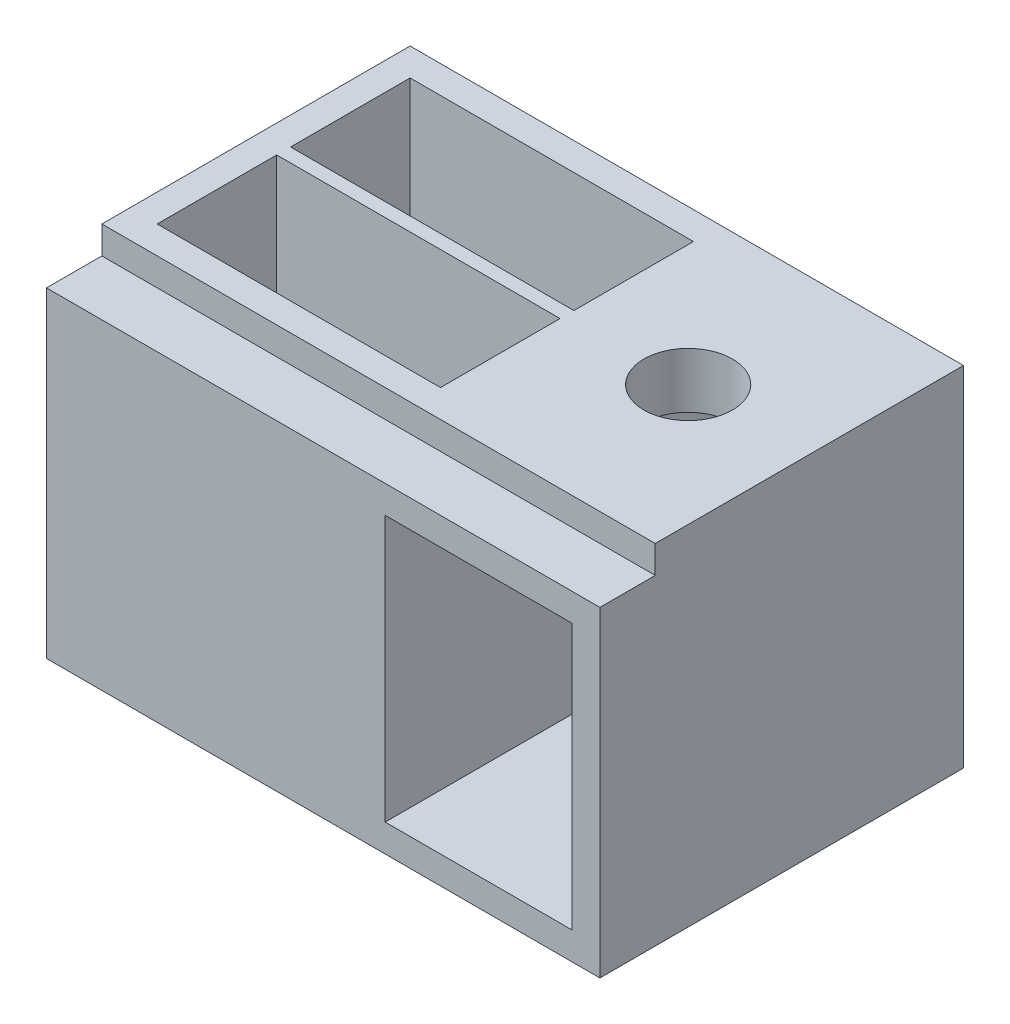
ISO-10303-21;
HEADER;
FILE_DESCRIPTION(('STEP AP214'),'2;1');
FILE_NAME('part.step','',(''),(''),'','','');
FILE_SCHEMA(('AUTOMOTIVE_DESIGN { 1 0 10303 214 1 1 1 1 }'));
ENDSEC;
DATA;
#1=APPLICATION_CONTEXT('core data for automotive mechanical design processes');
#2=APPLICATION_PROTOCOL_DEFINITION('international standard','automotive_design',2000,#1);
#3=PRODUCT_CONTEXT('',#1,'mechanical');
#4=PRODUCT('Part','Part','',(#3));
#5=PRODUCT_RELATED_PRODUCT_CATEGORY('part','',(#4));
#6=PRODUCT_DEFINITION_FORMATION('','',#4);
#7=PRODUCT_DEFINITION_CONTEXT('part definition',#1,'design');
#8=PRODUCT_DEFINITION('design','',#6,#7);
#9=PRODUCT_DEFINITION_SHAPE('','',#8);
#10=(LENGTH_UNIT() NAMED_UNIT(*) SI_UNIT(.MILLI.,.METRE.));
#11=(NAMED_UNIT(*) PLANE_ANGLE_UNIT() SI_UNIT($,.RADIAN.));
#12=(NAMED_UNIT(*) SI_UNIT($,.STERADIAN.) SOLID_ANGLE_UNIT());
#13=UNCERTAINTY_MEASURE_WITH_UNIT(LENGTH_MEASURE(1.E-05),#10,'distance_accuracy_value','');
#14=(GEOMETRIC_REPRESENTATION_CONTEXT(3) GLOBAL_UNCERTAINTY_ASSIGNED_CONTEXT((#13)) GLOBAL_UNIT_ASSIGNED_CONTEXT((#10,
#11,#12)) REPRESENTATION_CONTEXT('',''));
#15=CARTESIAN_POINT('',(0.,0.,0.));
#16=DIRECTION('',(0.,0.,1.));
#17=DIRECTION('',(1.,0.,0.));
#18=AXIS2_PLACEMENT_3D('',#15,#16,#17);
#19=CARTESIAN_POINT('',(0.,36.83,6.35));
#20=DIRECTION('',(0.,1.,0.));
#21=DIRECTION('',(0.,0.,1.));
#22=AXIS2_PLACEMENT_3D('',#19,#20,#21);
#23=PLANE('',#22);
#24=DIRECTION('',(0.,0.,1.));
#25=VECTOR('',#24,1.);
#26=CARTESIAN_POINT('',(63.5,36.83,-86.1595920502706));
#27=LINE('',#26,#25);
#28=CARTESIAN_POINT('',(63.5,36.83,0.));
#29=VERTEX_POINT('',#28);
#30=CARTESIAN_POINT('',(63.5,36.83,6.35));
#31=VERTEX_POINT('',#30);
#32=EDGE_CURVE('E226',#29,#31,#27,.T.);
#33=ORIENTED_EDGE('',*,*,#32,.F.);
#34=DIRECTION('',(1.,0.,0.));
#35=VECTOR('',#34,1.);
#36=CARTESIAN_POINT('',(0.,36.83,0.));
#37=LINE('',#36,#35);
#38=CARTESIAN_POINT('',(0.,36.83,0.));
#39=VERTEX_POINT('',#38);
#40=EDGE_CURVE('E56',#39,#29,#37,.T.);
#41=ORIENTED_EDGE('',*,*,#40,.F.);
#42=DIRECTION('',(0.,0.,-1.));
#43=VECTOR('',#42,1.);
#44=CARTESIAN_POINT('',(0.,36.83,6.35));
#45=LINE('',#44,#43);
#46=CARTESIAN_POINT('',(0.,36.83,6.35));
#47=VERTEX_POINT('',#46);
#48=EDGE_CURVE('E247',#47,#39,#45,.T.);
#49=ORIENTED_EDGE('',*,*,#48,.F.);
#50=DIRECTION('',(1.,0.,0.));
#51=VECTOR('',#50,1.);
#52=CARTESIAN_POINT('',(0.,36.83,6.35));
#53=LINE('',#52,#51);
#54=EDGE_CURVE('E229',#47,#31,#53,.T.);
#55=ORIENTED_EDGE('',*,*,#54,.T.);
#56=EDGE_LOOP('',(#33,#41,#49,#55));
#57=FACE_BOUND('',#56,.T.);
#58=ADVANCED_FACE('F39',(#57),#23,.T.);
#59=CARTESIAN_POINT('',(38.862,3.175,0.));
#60=DIRECTION('',(-1.,0.,0.));
#61=DIRECTION('',(0.,0.,1.));
#62=AXIS2_PLACEMENT_3D('',#59,#60,#61);
#63=PLANE('',#62);
#64=DIRECTION('',(0.,-1.,0.));
#65=VECTOR('',#64,1.);
#66=CARTESIAN_POINT('',(38.862,0.,-32.8295));
#67=LINE('',#66,#65);
#68=CARTESIAN_POINT('',(38.862,33.655,-32.8295));
#69=VERTEX_POINT('',#68);
#70=CARTESIAN_POINT('',(38.862,3.175,-32.8295));
#71=VERTEX_POINT('',#70);
#72=EDGE_CURVE('E199',#69,#71,#67,.T.);
#73=ORIENTED_EDGE('',*,*,#72,.F.);
#74=DIRECTION('',(0.,0.,1.));
#75=VECTOR('',#74,1.);
#76=CARTESIAN_POINT('',(38.862,33.655,-86.1595920502706));
#77=LINE('',#76,#75);
#78=CARTESIAN_POINT('',(38.862,33.655,6.35));
#79=VERTEX_POINT('',#78);
#80=EDGE_CURVE('E219',#69,#79,#77,.T.);
#81=ORIENTED_EDGE('',*,*,#80,.T.);
#82=DIRECTION('',(0.,1.,0.));
#83=VECTOR('',#82,1.);
#84=CARTESIAN_POINT('',(38.862,0.,6.35));
#85=LINE('',#84,#83);
#86=CARTESIAN_POINT('',(38.862,3.175,6.35));
#87=VERTEX_POINT('',#86);
#88=EDGE_CURVE('E244',#87,#79,#85,.T.);
#89=ORIENTED_EDGE('',*,*,#88,.F.);
#90=DIRECTION('',(0.,0.,1.));
#91=VECTOR('',#90,1.);
#92=CARTESIAN_POINT('',(38.862,3.175,0.));
#93=LINE('',#92,#91);
#94=EDGE_CURVE('E251',#71,#87,#93,.T.);
#95=ORIENTED_EDGE('',*,*,#94,.F.);
#96=EDGE_LOOP('',(#73,#81,#89,#95));
#97=FACE_BOUND('',#96,.T.);
#98=ADVANCED_FACE('F372',(#97),#63,.F.);
#99=CARTESIAN_POINT('',(0.,3.175,0.));
#100=DIRECTION('',(0.,1.,0.));
#101=DIRECTION('',(0.,0.,1.));
#102=AXIS2_PLACEMENT_3D('',#99,#100,#101);
#103=PLANE('',#102);
#104=DIRECTION('',(0.,0.,1.));
#105=VECTOR('',#104,1.);
#106=CARTESIAN_POINT('',(60.325,3.175,-86.1595920502706));
#107=LINE('',#106,#105);
#108=CARTESIAN_POINT('',(60.325,3.175,-32.8295));
#109=VERTEX_POINT('',#108);
#110=CARTESIAN_POINT('',(60.325,3.175,6.35));
#111=VERTEX_POINT('',#110);
#112=EDGE_CURVE('E215',#109,#111,#107,.T.);
#113=ORIENTED_EDGE('',*,*,#112,.F.);
#114=DIRECTION('',(1.,0.,0.));
#115=VECTOR('',#114,1.);
#116=CARTESIAN_POINT('',(0.,3.175,-32.8295));
#117=LINE('',#116,#115);
#118=EDGE_CURVE('E64',#71,#109,#117,.T.);
#119=ORIENTED_EDGE('',*,*,#118,.F.);
#120=ORIENTED_EDGE('',*,*,#94,.T.);
#121=DIRECTION('',(-1.,0.,0.));
#122=VECTOR('',#121,1.);
#123=CARTESIAN_POINT('',(0.,3.175,6.35));
#124=LINE('',#123,#122);
#125=EDGE_CURVE('E241',#111,#87,#124,.T.);
#126=ORIENTED_EDGE('',*,*,#125,.F.);
#127=EDGE_LOOP('',(#113,#119,#120,#126));
#128=FACE_BOUND('',#127,.T.);
#129=ADVANCED_FACE('F378',(#128),#103,.T.);
#130=CARTESIAN_POINT('',(60.325,0.,-86.1595920502706));
#131=DIRECTION('',(1.,0.,0.));
#132=DIRECTION('',(0.,0.,-1.));
#133=AXIS2_PLACEMENT_3D('',#130,#131,#132);
#134=PLANE('',#133);
#135=DIRECTION('',(0.,1.,0.));
#136=VECTOR('',#135,1.);
#137=CARTESIAN_POINT('',(60.325,0.,-32.8295));
#138=LINE('',#137,#136);
#139=CARTESIAN_POINT('',(60.325,33.655,-32.8295));
#140=VERTEX_POINT('',#139);
#141=EDGE_CURVE('E205',#109,#140,#138,.T.);
#142=ORIENTED_EDGE('',*,*,#141,.F.);
#143=ORIENTED_EDGE('',*,*,#112,.T.);
#144=DIRECTION('',(0.,1.,0.));
#145=VECTOR('',#144,1.);
#146=CARTESIAN_POINT('',(60.325,0.,6.35));
#147=LINE('',#146,#145);
#148=CARTESIAN_POINT('',(60.325,33.655,6.35));
#149=VERTEX_POINT('',#148);
#150=EDGE_CURVE('E221',#111,#149,#147,.T.);
#151=ORIENTED_EDGE('',*,*,#150,.T.);
#152=DIRECTION('',(0.,0.,1.));
#153=VECTOR('',#152,1.);
#154=CARTESIAN_POINT('',(60.325,33.655,-86.1595920502706));
#155=LINE('',#154,#153);
#156=EDGE_CURVE('E220',#140,#149,#155,.T.);
#157=ORIENTED_EDGE('',*,*,#156,.F.);
#158=EDGE_LOOP('',(#142,#143,#151,#157));
#159=FACE_BOUND('',#158,.T.);
#160=ADVANCED_FACE('F386',(#159),#134,.F.);
#161=CARTESIAN_POINT('',(0.,33.655,-86.1595920502706));
#162=DIRECTION('',(0.,1.,0.));
#163=DIRECTION('',(0.,0.,1.));
#164=AXIS2_PLACEMENT_3D('',#161,#162,#163);
#165=PLANE('',#164);
#166=CARTESIAN_POINT('',(49.5935,33.655,-17.68475));
#167=DIRECTION('',(0.,1.,0.));
#168=DIRECTION('',(0.,0.,1.));
#169=AXIS2_PLACEMENT_3D('',#166,#167,#168);
#170=CIRCLE('',#169,5.08);
#171=CARTESIAN_POINT('',(49.5935,33.655,-12.60475));
#172=VERTEX_POINT('',#171);
#173=EDGE_CURVE('E189',#172,#172,#170,.F.);
#174=ORIENTED_EDGE('',*,*,#173,.F.);
#175=EDGE_LOOP('',(#174));
#176=FACE_BOUND('',#175,.T.);
#177=DIRECTION('',(-1.,0.,0.));
#178=VECTOR('',#177,1.);
#179=CARTESIAN_POINT('',(0.,33.655,-32.8295));
#180=LINE('',#179,#178);
#181=EDGE_CURVE('E202',#140,#69,#180,.T.);
#182=ORIENTED_EDGE('',*,*,#181,.F.);
#183=ORIENTED_EDGE('',*,*,#156,.T.);
#184=DIRECTION('',(-1.,0.,0.));
#185=VECTOR('',#184,1.);
#186=CARTESIAN_POINT('',(0.,33.655,6.35));
#187=LINE('',#186,#185);
#188=EDGE_CURVE('E216',#149,#79,#187,.T.);
#189=ORIENTED_EDGE('',*,*,#188,.T.);
#190=ORIENTED_EDGE('',*,*,#80,.F.);
#191=EDGE_LOOP('',(#182,#183,#189,#190));
#192=FACE_BOUND('',#191,.T.);
#193=ADVANCED_FACE('F411',(#176,#192),#165,.F.);
#194=CARTESIAN_POINT('',(63.5,40.005,0.));
#195=DIRECTION('',(-1.,0.,0.));
#196=DIRECTION('',(0.,0.,1.));
#197=AXIS2_PLACEMENT_3D('',#194,#195,#196);
#198=PLANE('',#197);
#199=DIRECTION('',(0.,0.,-1.));
#200=VECTOR('',#199,1.);
#201=CARTESIAN_POINT('',(63.5,0.,0.));
#202=LINE('',#201,#200);
#203=CARTESIAN_POINT('',(63.5,0.,6.35));
#204=VERTEX_POINT('',#203);
#205=CARTESIAN_POINT('',(63.5,0.,-35.3695));
#206=VERTEX_POINT('',#205);
#207=EDGE_CURVE('E271',#204,#206,#202,.T.);
#208=ORIENTED_EDGE('',*,*,#207,.T.);
#209=DIRECTION('',(0.,1.,0.));
#210=VECTOR('',#209,1.);
#211=CARTESIAN_POINT('',(63.5,36.83,-35.3695));
#212=LINE('',#211,#210);
#213=CARTESIAN_POINT('',(63.5,40.005,-35.3695));
#214=VERTEX_POINT('',#213);
#215=EDGE_CURVE('E188',#206,#214,#212,.T.);
#216=ORIENTED_EDGE('',*,*,#215,.T.);
#217=DIRECTION('',(0.,0.,-1.));
#218=VECTOR('',#217,1.);
#219=CARTESIAN_POINT('',(63.5,40.005,-35.3695));
#220=LINE('',#219,#218);
#221=CARTESIAN_POINT('',(63.5,40.005,0.));
#222=VERTEX_POINT('',#221);
#223=EDGE_CURVE('E175',#222,#214,#220,.T.);
#224=ORIENTED_EDGE('',*,*,#223,.F.);
#225=DIRECTION('',(0.,-1.,0.));
#226=VECTOR('',#225,1.);
#227=CARTESIAN_POINT('',(63.5,40.005,0.));
#228=LINE('',#227,#226);
#229=EDGE_CURVE('E181',#222,#29,#228,.T.);
#230=ORIENTED_EDGE('',*,*,#229,.T.);
#231=ORIENTED_EDGE('',*,*,#32,.T.);
#232=DIRECTION('',(0.,1.,0.));
#233=VECTOR('',#232,1.);
#234=CARTESIAN_POINT('',(63.5,0.,6.35));
#235=LINE('',#234,#233);
#236=EDGE_CURVE('E238',#204,#31,#235,.T.);
#237=ORIENTED_EDGE('',*,*,#236,.F.);
#238=EDGE_LOOP('',(#208,#216,#224,#230,#231,#237));
#239=FACE_BOUND('',#238,.T.);
#240=ADVANCED_FACE('F187',(#239),#198,.F.);
#241=CARTESIAN_POINT('',(0.,40.005,-18.4785));
#242=DIRECTION('',(0.,0.,-1.));
#243=DIRECTION('',(-1.,0.,0.));
#244=AXIS2_PLACEMENT_3D('',#241,#242,#243);
#245=PLANE('',#244);
#246=DIRECTION('',(0.,-1.,0.));
#247=VECTOR('',#246,1.);
#248=CARTESIAN_POINT('',(35.687,40.005,-18.4785));
#249=LINE('',#248,#247);
#250=CARTESIAN_POINT('',(35.687,40.005,-18.4785));
#251=VERTEX_POINT('',#250);
#252=CARTESIAN_POINT('',(35.687,2.54,-18.4785));
#253=VERTEX_POINT('',#252);
#254=EDGE_CURVE('E308',#251,#253,#249,.T.);
#255=ORIENTED_EDGE('',*,*,#254,.T.);
#256=DIRECTION('',(1.,0.,0.));
#257=VECTOR('',#256,1.);
#258=CARTESIAN_POINT('',(0.,2.54,-18.4785));
#259=LINE('',#258,#257);
#260=CARTESIAN_POINT('',(3.175,2.54,-18.4785));
#261=VERTEX_POINT('',#260);
#262=EDGE_CURVE('E256',#261,#253,#259,.T.);
#263=ORIENTED_EDGE('',*,*,#262,.F.);
#264=DIRECTION('',(0.,-1.,0.));
#265=VECTOR('',#264,1.);
#266=CARTESIAN_POINT('',(3.175,40.005,-18.4785));
#267=LINE('',#266,#265);
#268=CARTESIAN_POINT('',(3.175,40.005,-18.4785));
#269=VERTEX_POINT('',#268);
#270=EDGE_CURVE('E303',#269,#261,#267,.T.);
#271=ORIENTED_EDGE('',*,*,#270,.F.);
#272=DIRECTION('',(1.,0.,0.));
#273=VECTOR('',#272,1.);
#274=CARTESIAN_POINT('',(0.,40.005,-18.4785));
#275=LINE('',#274,#273);
#276=EDGE_CURVE('E274',#269,#251,#275,.T.);
#277=ORIENTED_EDGE('',*,*,#276,.T.);
#278=EDGE_LOOP('',(#255,#263,#271,#277));
#279=FACE_BOUND('',#278,.T.);
#280=ADVANCED_FACE('F325',(#279),#245,.T.);
#281=CARTESIAN_POINT('',(3.175,40.005,0.));
#282=DIRECTION('',(-1.,0.,0.));
#283=DIRECTION('',(0.,0.,1.));
#284=AXIS2_PLACEMENT_3D('',#281,#282,#283);
#285=PLANE('',#284);
#286=DIRECTION('',(0.,0.,1.));
#287=VECTOR('',#286,1.);
#288=CARTESIAN_POINT('',(3.175,2.54,0.));
#289=LINE('',#288,#287);
#290=CARTESIAN_POINT('',(3.175,2.54,-32.1945));
#291=VERTEX_POINT('',#290);
#292=EDGE_CURVE('E258',#291,#261,#289,.T.);
#293=ORIENTED_EDGE('',*,*,#292,.F.);
#294=DIRECTION('',(0.,-1.,0.));
#295=VECTOR('',#294,1.);
#296=CARTESIAN_POINT('',(3.175,40.005,-32.1945));
#297=LINE('',#296,#295);
#298=CARTESIAN_POINT('',(3.175,40.005,-32.1945));
#299=VERTEX_POINT('',#298);
#300=EDGE_CURVE('E314',#299,#291,#297,.T.);
#301=ORIENTED_EDGE('',*,*,#300,.F.);
#302=DIRECTION('',(0.,0.,-1.));
#303=VECTOR('',#302,1.);
#304=CARTESIAN_POINT('',(3.175,40.005,0.));
#305=LINE('',#304,#303);
#306=EDGE_CURVE('E277',#269,#299,#305,.T.);
#307=ORIENTED_EDGE('',*,*,#306,.F.);
#308=ORIENTED_EDGE('',*,*,#270,.T.);
#309=EDGE_LOOP('',(#293,#301,#307,#308));
#310=FACE_BOUND('',#309,.T.);
#311=ADVANCED_FACE('F320',(#310),#285,.F.);
#312=CARTESIAN_POINT('',(0.,40.005,-32.1945));
#313=DIRECTION('',(0.,0.,-1.));
#314=DIRECTION('',(-1.,0.,0.));
#315=AXIS2_PLACEMENT_3D('',#312,#313,#314);
#316=PLANE('',#315);
#317=DIRECTION('',(-1.,0.,0.));
#318=VECTOR('',#317,1.);
#319=CARTESIAN_POINT('',(0.,2.54,-32.1945));
#320=LINE('',#319,#318);
#321=CARTESIAN_POINT('',(35.687,2.54,-32.1945));
#322=VERTEX_POINT('',#321);
#323=EDGE_CURVE('E260',#322,#291,#320,.T.);
#324=ORIENTED_EDGE('',*,*,#323,.F.);
#325=DIRECTION('',(0.,-1.,0.));
#326=VECTOR('',#325,1.);
#327=CARTESIAN_POINT('',(35.687,40.005,-32.1945));
#328=LINE('',#327,#326);
#329=CARTESIAN_POINT('',(35.687,40.005,-32.1945));
#330=VERTEX_POINT('',#329);
#331=EDGE_CURVE('E311',#330,#322,#328,.T.);
#332=ORIENTED_EDGE('',*,*,#331,.F.);
#333=DIRECTION('',(1.,0.,0.));
#334=VECTOR('',#333,1.);
#335=CARTESIAN_POINT('',(0.,40.005,-32.1945));
#336=LINE('',#335,#334);
#337=EDGE_CURVE('E280',#299,#330,#336,.T.);
#338=ORIENTED_EDGE('',*,*,#337,.F.);
#339=ORIENTED_EDGE('',*,*,#300,.T.);
#340=EDGE_LOOP('',(#324,#332,#338,#339));
#341=FACE_BOUND('',#340,.T.);
#342=ADVANCED_FACE('F335',(#341),#316,.F.);
#343=CARTESIAN_POINT('',(35.687,40.005,0.));
#344=DIRECTION('',(-1.,0.,0.));
#345=DIRECTION('',(0.,0.,1.));
#346=AXIS2_PLACEMENT_3D('',#343,#344,#345);
#347=PLANE('',#346);
#348=ORIENTED_EDGE('',*,*,#331,.T.);
#349=DIRECTION('',(0.,0.,-1.));
#350=VECTOR('',#349,1.);
#351=CARTESIAN_POINT('',(35.687,2.54,0.));
#352=LINE('',#351,#350);
#353=EDGE_CURVE('E262',#253,#322,#352,.T.);
#354=ORIENTED_EDGE('',*,*,#353,.F.);
#355=ORIENTED_EDGE('',*,*,#254,.F.);
#356=DIRECTION('',(0.,0.,-1.));
#357=VECTOR('',#356,1.);
#358=CARTESIAN_POINT('',(35.687,40.005,0.));
#359=LINE('',#358,#357);
#360=EDGE_CURVE('E282',#251,#330,#359,.T.);
#361=ORIENTED_EDGE('',*,*,#360,.T.);
#362=EDGE_LOOP('',(#348,#354,#355,#361));
#363=FACE_BOUND('',#362,.T.);
#364=ADVANCED_FACE('F332',(#363),#347,.T.);
#365=CARTESIAN_POINT('',(0.,40.005,-3.175));
#366=DIRECTION('',(0.,0.,-1.));
#367=DIRECTION('',(-1.,0.,0.));
#368=AXIS2_PLACEMENT_3D('',#365,#366,#367);
#369=PLANE('',#368);
#370=DIRECTION('',(0.,-1.,0.));
#371=VECTOR('',#370,1.);
#372=CARTESIAN_POINT('',(35.687,40.005,-3.175));
#373=LINE('',#372,#371);
#374=CARTESIAN_POINT('',(35.687,40.005,-3.175));
#375=VERTEX_POINT('',#374);
#376=CARTESIAN_POINT('',(35.687,2.54,-3.175));
#377=VERTEX_POINT('',#376);
#378=EDGE_CURVE('E299',#375,#377,#373,.T.);
#379=ORIENTED_EDGE('',*,*,#378,.T.);
#380=DIRECTION('',(1.,0.,0.));
#381=VECTOR('',#380,1.);
#382=CARTESIAN_POINT('',(0.,2.54,-3.175));
#383=LINE('',#382,#381);
#384=CARTESIAN_POINT('',(3.175,2.54,-3.175));
#385=VERTEX_POINT('',#384);
#386=EDGE_CURVE('E264',#385,#377,#383,.T.);
#387=ORIENTED_EDGE('',*,*,#386,.F.);
#388=DIRECTION('',(0.,-1.,0.));
#389=VECTOR('',#388,1.);
#390=CARTESIAN_POINT('',(3.175,40.005,-3.175));
#391=LINE('',#390,#389);
#392=CARTESIAN_POINT('',(3.175,40.005,-3.175));
#393=VERTEX_POINT('',#392);
#394=EDGE_CURVE('E11',#393,#385,#391,.T.);
#395=ORIENTED_EDGE('',*,*,#394,.F.);
#396=DIRECTION('',(1.,0.,0.));
#397=VECTOR('',#396,1.);
#398=CARTESIAN_POINT('',(0.,40.005,-3.175));
#399=LINE('',#398,#397);
#400=EDGE_CURVE('E285',#393,#375,#399,.T.);
#401=ORIENTED_EDGE('',*,*,#400,.T.);
#402=EDGE_LOOP('',(#379,#387,#395,#401));
#403=FACE_BOUND('',#402,.T.);
#404=ADVANCED_FACE('F347',(#403),#369,.T.);
#405=CARTESIAN_POINT('',(3.175,40.005,0.));
#406=DIRECTION('',(-1.,0.,0.));
#407=DIRECTION('',(0.,0.,1.));
#408=AXIS2_PLACEMENT_3D('',#405,#406,#407);
#409=PLANE('',#408);
#410=DIRECTION('',(0.,0.,1.));
#411=VECTOR('',#410,1.);
#412=CARTESIAN_POINT('',(3.175,2.54,0.));
#413=LINE('',#412,#411);
#414=CARTESIAN_POINT('',(3.175,2.54,-16.891));
#415=VERTEX_POINT('',#414);
#416=EDGE_CURVE('E266',#415,#385,#413,.T.);
#417=ORIENTED_EDGE('',*,*,#416,.F.);
#418=DIRECTION('',(0.,-1.,0.));
#419=VECTOR('',#418,1.);
#420=CARTESIAN_POINT('',(3.175,40.005,-16.891));
#421=LINE('',#420,#419);
#422=CARTESIAN_POINT('',(3.175,40.005,-16.891));
#423=VERTEX_POINT('',#422);
#424=EDGE_CURVE('E48',#423,#415,#421,.T.);
#425=ORIENTED_EDGE('',*,*,#424,.F.);
#426=DIRECTION('',(0.,0.,-1.));
#427=VECTOR('',#426,1.);
#428=CARTESIAN_POINT('',(3.175,40.005,0.));
#429=LINE('',#428,#427);
#430=EDGE_CURVE('E288',#393,#423,#429,.T.);
#431=ORIENTED_EDGE('',*,*,#430,.F.);
#432=ORIENTED_EDGE('',*,*,#394,.T.);
#433=EDGE_LOOP('',(#417,#425,#431,#432));
#434=FACE_BOUND('',#433,.T.);
#435=ADVANCED_FACE('F351',(#434),#409,.F.);
#436=CARTESIAN_POINT('',(0.,40.005,-16.891));
#437=DIRECTION('',(0.,0.,-1.));
#438=DIRECTION('',(-1.,0.,0.));
#439=AXIS2_PLACEMENT_3D('',#436,#437,#438);
#440=PLANE('',#439);
#441=DIRECTION('',(-1.,0.,0.));
#442=VECTOR('',#441,1.);
#443=CARTESIAN_POINT('',(0.,2.54,-16.891));
#444=LINE('',#443,#442);
#445=CARTESIAN_POINT('',(35.687,2.54,-16.891));
#446=VERTEX_POINT('',#445);
#447=EDGE_CURVE('E268',#446,#415,#444,.T.);
#448=ORIENTED_EDGE('',*,*,#447,.F.);
#449=DIRECTION('',(0.,-1.,0.));
#450=VECTOR('',#449,1.);
#451=CARTESIAN_POINT('',(35.687,40.005,-16.891));
#452=LINE('',#451,#450);
#453=CARTESIAN_POINT('',(35.687,40.005,-16.891));
#454=VERTEX_POINT('',#453);
#455=EDGE_CURVE('E302',#454,#446,#452,.T.);
#456=ORIENTED_EDGE('',*,*,#455,.F.);
#457=DIRECTION('',(1.,0.,0.));
#458=VECTOR('',#457,1.);
#459=CARTESIAN_POINT('',(0.,40.005,-16.891));
#460=LINE('',#459,#458);
#461=EDGE_CURVE('E291',#423,#454,#460,.T.);
#462=ORIENTED_EDGE('',*,*,#461,.F.);
#463=ORIENTED_EDGE('',*,*,#424,.T.);
#464=EDGE_LOOP('',(#448,#456,#462,#463));
#465=FACE_BOUND('',#464,.T.);
#466=ADVANCED_FACE('F354',(#465),#440,.F.);
#467=CARTESIAN_POINT('',(35.687,40.005,0.));
#468=DIRECTION('',(-1.,0.,0.));
#469=DIRECTION('',(0.,0.,1.));
#470=AXIS2_PLACEMENT_3D('',#467,#468,#469);
#471=PLANE('',#470);
#472=ORIENTED_EDGE('',*,*,#455,.T.);
#473=DIRECTION('',(0.,0.,-1.));
#474=VECTOR('',#473,1.);
#475=CARTESIAN_POINT('',(35.687,2.54,0.));
#476=LINE('',#475,#474);
#477=EDGE_CURVE('E270',#377,#446,#476,.T.);
#478=ORIENTED_EDGE('',*,*,#477,.F.);
#479=ORIENTED_EDGE('',*,*,#378,.F.);
#480=DIRECTION('',(0.,0.,-1.));
#481=VECTOR('',#480,1.);
#482=CARTESIAN_POINT('',(35.687,40.005,0.));
#483=LINE('',#482,#481);
#484=EDGE_CURVE('E293',#375,#454,#483,.T.);
#485=ORIENTED_EDGE('',*,*,#484,.T.);
#486=EDGE_LOOP('',(#472,#478,#479,#485));
#487=FACE_BOUND('',#486,.T.);
#488=ADVANCED_FACE('F358',(#487),#471,.T.);
#489=CARTESIAN_POINT('',(0.,40.005,0.));
#490=DIRECTION('',(0.,0.,-1.));
#491=DIRECTION('',(-1.,0.,0.));
#492=AXIS2_PLACEMENT_3D('',#489,#490,#491);
#493=PLANE('',#492);
#494=DIRECTION('',(0.,-1.,0.));
#495=VECTOR('',#494,1.);
#496=CARTESIAN_POINT('',(0.,40.005,0.));
#497=LINE('',#496,#495);
#498=CARTESIAN_POINT('',(0.,40.005,0.));
#499=VERTEX_POINT('',#498);
#500=EDGE_CURVE('E43',#499,#39,#497,.T.);
#501=ORIENTED_EDGE('',*,*,#500,.T.);
#502=ORIENTED_EDGE('',*,*,#40,.T.);
#503=ORIENTED_EDGE('',*,*,#229,.F.);
#504=DIRECTION('',(1.,0.,0.));
#505=VECTOR('',#504,1.);
#506=CARTESIAN_POINT('',(0.,40.005,0.));
#507=LINE('',#506,#505);
#508=EDGE_CURVE('E170',#499,#222,#507,.T.);
#509=ORIENTED_EDGE('',*,*,#508,.F.);
#510=EDGE_LOOP('',(#501,#502,#503,#509));
#511=FACE_BOUND('',#510,.T.);
#512=ADVANCED_FACE('F41',(#511),#493,.F.);
#513=CARTESIAN_POINT('',(0.,40.005,0.));
#514=DIRECTION('',(-1.,0.,0.));
#515=DIRECTION('',(0.,0.,1.));
#516=AXIS2_PLACEMENT_3D('',#513,#514,#515);
#517=PLANE('',#516);
#518=DIRECTION('',(0.,1.,0.));
#519=VECTOR('',#518,1.);
#520=CARTESIAN_POINT('',(0.,3.175,-35.3695));
#521=LINE('',#520,#519);
#522=CARTESIAN_POINT('',(0.,0.,-35.3695));
#523=VERTEX_POINT('',#522);
#524=CARTESIAN_POINT('',(0.,40.005,-35.3695));
#525=VERTEX_POINT('',#524);
#526=EDGE_CURVE('E253',#523,#525,#521,.T.);
#527=ORIENTED_EDGE('',*,*,#526,.F.);
#528=DIRECTION('',(0.,0.,-1.));
#529=VECTOR('',#528,1.);
#530=CARTESIAN_POINT('',(0.,0.,0.));
#531=LINE('',#530,#529);
#532=CARTESIAN_POINT('',(0.,0.,6.35));
#533=VERTEX_POINT('',#532);
#534=EDGE_CURVE('E178',#533,#523,#531,.T.);
#535=ORIENTED_EDGE('',*,*,#534,.F.);
#536=DIRECTION('',(0.,-1.,0.));
#537=VECTOR('',#536,1.);
#538=CARTESIAN_POINT('',(0.,0.,6.35));
#539=LINE('',#538,#537);
#540=EDGE_CURVE('E232',#47,#533,#539,.T.);
#541=ORIENTED_EDGE('',*,*,#540,.F.);
#542=ORIENTED_EDGE('',*,*,#48,.T.);
#543=ORIENTED_EDGE('',*,*,#500,.F.);
#544=DIRECTION('',(0.,0.,-1.));
#545=VECTOR('',#544,1.);
#546=CARTESIAN_POINT('',(0.,40.005,0.));
#547=LINE('',#546,#545);
#548=EDGE_CURVE('E177',#499,#525,#547,.T.);
#549=ORIENTED_EDGE('',*,*,#548,.T.);
#550=EDGE_LOOP('',(#527,#535,#541,#542,#543,#549));
#551=FACE_BOUND('',#550,.T.);
#552=ADVANCED_FACE('F339',(#551),#517,.T.);
#553=CARTESIAN_POINT('',(0.,40.005,0.));
#554=DIRECTION('',(0.,1.,0.));
#555=DIRECTION('',(0.,0.,1.));
#556=AXIS2_PLACEMENT_3D('',#553,#554,#555);
#557=PLANE('',#556);
#558=CARTESIAN_POINT('',(49.5935,40.005,-17.68475));
#559=DIRECTION('',(0.,1.,0.));
#560=DIRECTION('',(0.,0.,1.));
#561=AXIS2_PLACEMENT_3D('',#558,#559,#560);
#562=CIRCLE('',#561,5.08);
#563=CARTESIAN_POINT('',(49.5935,40.005,-12.60475));
#564=VERTEX_POINT('',#563);
#565=EDGE_CURVE('E192',#564,#564,#562,.T.);
#566=ORIENTED_EDGE('',*,*,#565,.F.);
#567=EDGE_LOOP('',(#566));
#568=FACE_BOUND('',#567,.T.);
#569=DIRECTION('',(1.,0.,0.));
#570=VECTOR('',#569,1.);
#571=CARTESIAN_POINT('',(0.,40.005,-35.3695));
#572=LINE('',#571,#570);
#573=EDGE_CURVE('E250',#525,#214,#572,.T.);
#574=ORIENTED_EDGE('',*,*,#573,.F.);
#575=ORIENTED_EDGE('',*,*,#548,.F.);
#576=ORIENTED_EDGE('',*,*,#508,.T.);
#577=ORIENTED_EDGE('',*,*,#223,.T.);
#578=EDGE_LOOP('',(#574,#575,#576,#577));
#579=FACE_BOUND('',#578,.T.);
#580=ORIENTED_EDGE('',*,*,#276,.F.);
#581=ORIENTED_EDGE('',*,*,#306,.T.);
#582=ORIENTED_EDGE('',*,*,#337,.T.);
#583=ORIENTED_EDGE('',*,*,#360,.F.);
#584=EDGE_LOOP('',(#580,#581,#582,#583));
#585=FACE_BOUND('',#584,.T.);
#586=ORIENTED_EDGE('',*,*,#400,.F.);
#587=ORIENTED_EDGE('',*,*,#430,.T.);
#588=ORIENTED_EDGE('',*,*,#461,.T.);
#589=ORIENTED_EDGE('',*,*,#484,.F.);
#590=EDGE_LOOP('',(#586,#587,#588,#589));
#591=FACE_BOUND('',#590,.T.);
#592=ADVANCED_FACE('F172',(#568,#579,#585,#591),#557,.T.);
#593=CARTESIAN_POINT('',(0.,0.,0.));
#594=DIRECTION('',(0.,1.,0.));
#595=DIRECTION('',(0.,0.,1.));
#596=AXIS2_PLACEMENT_3D('',#593,#594,#595);
#597=PLANE('',#596);
#598=ORIENTED_EDGE('',*,*,#534,.T.);
#599=DIRECTION('',(-1.,0.,0.));
#600=VECTOR('',#599,1.);
#601=CARTESIAN_POINT('',(63.5,0.,-35.3695));
#602=LINE('',#601,#600);
#603=EDGE_CURVE('E212',#206,#523,#602,.T.);
#604=ORIENTED_EDGE('',*,*,#603,.F.);
#605=ORIENTED_EDGE('',*,*,#207,.F.);
#606=DIRECTION('',(1.,0.,0.));
#607=VECTOR('',#606,1.);
#608=CARTESIAN_POINT('',(0.,0.,6.35));
#609=LINE('',#608,#607);
#610=EDGE_CURVE('E235',#533,#204,#609,.T.);
#611=ORIENTED_EDGE('',*,*,#610,.F.);
#612=EDGE_LOOP('',(#598,#604,#605,#611));
#613=FACE_BOUND('',#612,.T.);
#614=ADVANCED_FACE('F338',(#613),#597,.F.);
#615=CARTESIAN_POINT('',(0.,2.54,0.));
#616=DIRECTION('',(0.,-1.,0.));
#617=DIRECTION('',(0.,0.,-1.));
#618=AXIS2_PLACEMENT_3D('',#615,#616,#617);
#619=PLANE('',#618);
#620=ORIENTED_EDGE('',*,*,#386,.T.);
#621=ORIENTED_EDGE('',*,*,#477,.T.);
#622=ORIENTED_EDGE('',*,*,#447,.T.);
#623=ORIENTED_EDGE('',*,*,#416,.T.);
#624=EDGE_LOOP('',(#620,#621,#622,#623));
#625=FACE_BOUND('',#624,.T.);
#626=ADVANCED_FACE('F360',(#625),#619,.F.);
#627=CARTESIAN_POINT('',(0.,2.54,0.));
#628=DIRECTION('',(0.,-1.,0.));
#629=DIRECTION('',(0.,0.,-1.));
#630=AXIS2_PLACEMENT_3D('',#627,#628,#629);
#631=PLANE('',#630);
#632=ORIENTED_EDGE('',*,*,#262,.T.);
#633=ORIENTED_EDGE('',*,*,#353,.T.);
#634=ORIENTED_EDGE('',*,*,#323,.T.);
#635=ORIENTED_EDGE('',*,*,#292,.T.);
#636=EDGE_LOOP('',(#632,#633,#634,#635));
#637=FACE_BOUND('',#636,.T.);
#638=ADVANCED_FACE('F329',(#637),#631,.F.);
#639=CARTESIAN_POINT('',(0.,3.175,-35.3695));
#640=DIRECTION('',(0.,0.,1.));
#641=DIRECTION('',(1.,0.,0.));
#642=AXIS2_PLACEMENT_3D('',#639,#640,#641);
#643=PLANE('',#642);
#644=ORIENTED_EDGE('',*,*,#573,.T.);
#645=ORIENTED_EDGE('',*,*,#215,.F.);
#646=ORIENTED_EDGE('',*,*,#603,.T.);
#647=ORIENTED_EDGE('',*,*,#526,.T.);
#648=EDGE_LOOP('',(#644,#645,#646,#647));
#649=FACE_BOUND('',#648,.T.);
#650=CARTESIAN_POINT('',(49.5935,18.415,-35.3695));
#651=DIRECTION('',(0.,0.,-1.));
#652=DIRECTION('',(-1.,0.,0.));
#653=AXIS2_PLACEMENT_3D('',#650,#651,#652);
#654=CIRCLE('',#653,5.08);
#655=CARTESIAN_POINT('',(44.5135,18.415,-35.3695));
#656=VERTEX_POINT('',#655);
#657=EDGE_CURVE('E183',#656,#656,#654,.T.);
#658=ORIENTED_EDGE('',*,*,#657,.F.);
#659=EDGE_LOOP('',(#658));
#660=FACE_BOUND('',#659,.T.);
#661=ADVANCED_FACE('F367',(#649,#660),#643,.F.);
#662=CARTESIAN_POINT('',(0.,0.,6.35));
#663=DIRECTION('',(0.,0.,1.));
#664=DIRECTION('',(1.,0.,0.));
#665=AXIS2_PLACEMENT_3D('',#662,#663,#664);
#666=PLANE('',#665);
#667=ORIENTED_EDGE('',*,*,#236,.T.);
#668=ORIENTED_EDGE('',*,*,#54,.F.);
#669=ORIENTED_EDGE('',*,*,#540,.T.);
#670=ORIENTED_EDGE('',*,*,#610,.T.);
#671=EDGE_LOOP('',(#667,#668,#669,#670));
#672=FACE_BOUND('',#671,.T.);
#673=ORIENTED_EDGE('',*,*,#88,.T.);
#674=ORIENTED_EDGE('',*,*,#188,.F.);
#675=ORIENTED_EDGE('',*,*,#150,.F.);
#676=ORIENTED_EDGE('',*,*,#125,.T.);
#677=EDGE_LOOP('',(#673,#674,#675,#676));
#678=FACE_BOUND('',#677,.T.);
#679=ADVANCED_FACE('F383',(#672,#678),#666,.T.);
#680=CARTESIAN_POINT('',(49.5935,18.415,-32.8295));
#681=DIRECTION('',(0.,0.,-1.));
#682=DIRECTION('',(-1.,0.,0.));
#683=AXIS2_PLACEMENT_3D('',#680,#681,#682);
#684=CYLINDRICAL_SURFACE('',#683,5.08);
#685=CARTESIAN_POINT('',(49.5935,18.415,-32.8295));
#686=DIRECTION('',(0.,0.,-1.));
#687=DIRECTION('',(-1.,0.,0.));
#688=AXIS2_PLACEMENT_3D('',#685,#686,#687);
#689=CIRCLE('',#688,5.08);
#690=CARTESIAN_POINT('',(44.5135,18.415,-32.8295));
#691=VERTEX_POINT('',#690);
#692=EDGE_CURVE('E196',#691,#691,#689,.T.);
#693=ORIENTED_EDGE('',*,*,#692,.F.);
#694=EDGE_LOOP('',(#693));
#695=FACE_BOUND('',#694,.T.);
#696=ORIENTED_EDGE('',*,*,#657,.T.);
#697=EDGE_LOOP('',(#696));
#698=FACE_BOUND('',#697,.T.);
#699=ADVANCED_FACE('F393',(#695,#698),#684,.F.);
#700=CARTESIAN_POINT('',(0.,0.,-32.8295));
#701=DIRECTION('',(0.,0.,-1.));
#702=DIRECTION('',(-1.,0.,0.));
#703=AXIS2_PLACEMENT_3D('',#700,#701,#702);
#704=PLANE('',#703);
#705=ORIENTED_EDGE('',*,*,#692,.T.);
#706=EDGE_LOOP('',(#705));
#707=FACE_BOUND('',#706,.T.);
#708=ORIENTED_EDGE('',*,*,#72,.T.);
#709=ORIENTED_EDGE('',*,*,#118,.T.);
#710=ORIENTED_EDGE('',*,*,#141,.T.);
#711=ORIENTED_EDGE('',*,*,#181,.T.);
#712=EDGE_LOOP('',(#708,#709,#710,#711));
#713=FACE_BOUND('',#712,.T.);
#714=ADVANCED_FACE('F399',(#707,#713),#704,.F.);
#715=CARTESIAN_POINT('',(49.5935,19.2865902062894,-17.68475));
#716=DIRECTION('',(0.,1.,0.));
#717=DIRECTION('',(0.,0.,1.));
#718=AXIS2_PLACEMENT_3D('',#715,#716,#717);
#719=CYLINDRICAL_SURFACE('',#718,5.08);
#720=ORIENTED_EDGE('',*,*,#173,.T.);
#721=EDGE_LOOP('',(#720));
#722=FACE_BOUND('',#721,.T.);
#723=ORIENTED_EDGE('',*,*,#565,.T.);
#724=EDGE_LOOP('',(#723));
#725=FACE_BOUND('',#724,.T.);
#726=ADVANCED_FACE('F405',(#722,#725),#719,.F.);
#727=CLOSED_SHELL('',(#58,#98,#129,#160,#193,#240,#280,#311,#342,#364,#404,#435,#466,#488,#512,
#552,#592,#614,#626,#638,#661,#679,#699,#714,#726));
#728=MANIFOLD_SOLID_BREP('B2',#727);
#729=ADVANCED_BREP_SHAPE_REPRESENTATION('',(#18,#728),#14);
#730=SHAPE_DEFINITION_REPRESENTATION(#9,#729);
ENDSEC;
END-ISO-10303-21;
